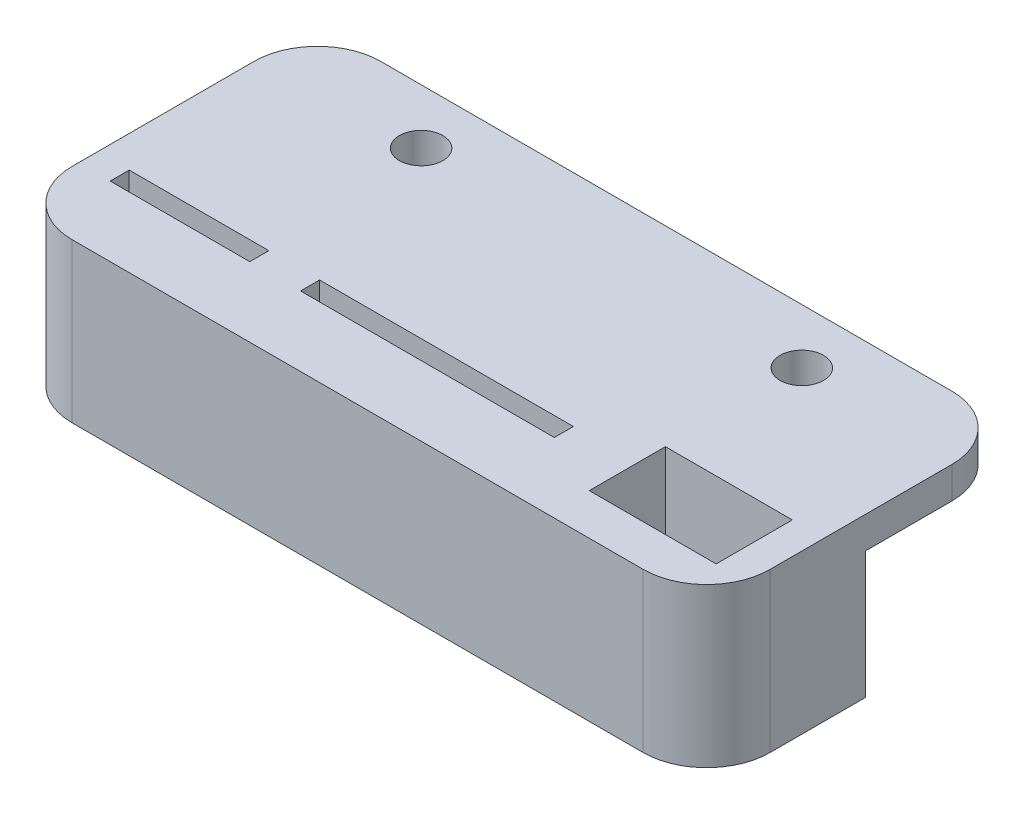
ISO-10303-21;
HEADER;
FILE_DESCRIPTION(('STEP AP214'),'2;1');
FILE_NAME('part.step','',(''),(''),'','','');
FILE_SCHEMA(('AUTOMOTIVE_DESIGN { 1 0 10303 214 1 1 1 1 }'));
ENDSEC;
DATA;
#1=APPLICATION_CONTEXT('core data for automotive mechanical design processes');
#2=APPLICATION_PROTOCOL_DEFINITION('international standard','automotive_design',2000,#1);
#3=PRODUCT_CONTEXT('',#1,'mechanical');
#4=PRODUCT('Part','Part','',(#3));
#5=PRODUCT_RELATED_PRODUCT_CATEGORY('part','',(#4));
#6=PRODUCT_DEFINITION_FORMATION('','',#4);
#7=PRODUCT_DEFINITION_CONTEXT('part definition',#1,'design');
#8=PRODUCT_DEFINITION('design','',#6,#7);
#9=PRODUCT_DEFINITION_SHAPE('','',#8);
#10=(LENGTH_UNIT() NAMED_UNIT(*) SI_UNIT(.MILLI.,.METRE.));
#11=(NAMED_UNIT(*) PLANE_ANGLE_UNIT() SI_UNIT($,.RADIAN.));
#12=(NAMED_UNIT(*) SI_UNIT($,.STERADIAN.) SOLID_ANGLE_UNIT());
#13=UNCERTAINTY_MEASURE_WITH_UNIT(LENGTH_MEASURE(1.E-05),#10,'distance_accuracy_value','');
#14=(GEOMETRIC_REPRESENTATION_CONTEXT(3) GLOBAL_UNCERTAINTY_ASSIGNED_CONTEXT((#13)) GLOBAL_UNIT_ASSIGNED_CONTEXT((#10,
#11,#12)) REPRESENTATION_CONTEXT('',''));
#15=CARTESIAN_POINT('',(0.,0.,0.));
#16=DIRECTION('',(0.,0.,1.));
#17=DIRECTION('',(1.,0.,0.));
#18=AXIS2_PLACEMENT_3D('',#15,#16,#17);
#19=CARTESIAN_POINT('',(55.,5.,15.));
#20=DIRECTION('',(-1.,0.,0.));
#21=DIRECTION('',(0.,0.,1.));
#22=AXIS2_PLACEMENT_3D('',#19,#20,#21);
#23=PLANE('',#22);
#24=DIRECTION('',(0.,0.,-1.));
#25=VECTOR('',#24,1.);
#26=CARTESIAN_POINT('',(55.,0.,15.));
#27=LINE('',#26,#25);
#28=CARTESIAN_POINT('',(55.,0.,15.));
#29=VERTEX_POINT('',#28);
#30=CARTESIAN_POINT('',(55.,0.,1.35));
#31=VERTEX_POINT('',#30);
#32=EDGE_CURVE('E321',#29,#31,#27,.T.);
#33=ORIENTED_EDGE('',*,*,#32,.T.);
#34=DIRECTION('',(0.,1.,0.));
#35=VECTOR('',#34,1.);
#36=CARTESIAN_POINT('',(55.,5.,1.35));
#37=LINE('',#36,#35);
#38=CARTESIAN_POINT('',(55.,5.,1.35));
#39=VERTEX_POINT('',#38);
#40=EDGE_CURVE('E11',#31,#39,#37,.T.);
#41=ORIENTED_EDGE('',*,*,#40,.T.);
#42=DIRECTION('',(0.,0.,-1.));
#43=VECTOR('',#42,1.);
#44=CARTESIAN_POINT('',(55.,5.,15.));
#45=LINE('',#44,#43);
#46=CARTESIAN_POINT('',(55.,5.,30.));
#47=VERTEX_POINT('',#46);
#48=EDGE_CURVE('E322',#47,#39,#45,.T.);
#49=ORIENTED_EDGE('',*,*,#48,.F.);
#50=DIRECTION('',(0.,1.,0.));
#51=VECTOR('',#50,1.);
#52=CARTESIAN_POINT('',(55.,-20.,30.));
#53=LINE('',#52,#51);
#54=CARTESIAN_POINT('',(55.,-20.,30.));
#55=VERTEX_POINT('',#54);
#56=EDGE_CURVE('E43',#47,#55,#53,.F.);
#57=ORIENTED_EDGE('',*,*,#56,.T.);
#58=DIRECTION('',(0.,0.,-1.));
#59=VECTOR('',#58,1.);
#60=CARTESIAN_POINT('',(55.,-20.,40.));
#61=LINE('',#60,#59);
#62=CARTESIAN_POINT('',(55.,-20.,15.));
#63=VERTEX_POINT('',#62);
#64=EDGE_CURVE('E308',#55,#63,#61,.T.);
#65=ORIENTED_EDGE('',*,*,#64,.T.);
#66=DIRECTION('',(0.,1.,0.));
#67=VECTOR('',#66,1.);
#68=CARTESIAN_POINT('',(55.,5.,15.));
#69=LINE('',#68,#67);
#70=EDGE_CURVE('E305',#63,#29,#69,.T.);
#71=ORIENTED_EDGE('',*,*,#70,.T.);
#72=EDGE_LOOP('',(#33,#41,#49,#57,#65,#71));
#73=FACE_BOUND('',#72,.T.);
#74=ADVANCED_FACE('F35',(#73),#23,.F.);
#75=CARTESIAN_POINT('',(-55.,5.,15.));
#76=DIRECTION('',(1.,0.,0.));
#77=DIRECTION('',(0.,0.,-1.));
#78=AXIS2_PLACEMENT_3D('',#75,#76,#77);
#79=PLANE('',#78);
#80=DIRECTION('',(0.,0.,-1.));
#81=VECTOR('',#80,1.);
#82=CARTESIAN_POINT('',(-55.,-20.,40.));
#83=LINE('',#82,#81);
#84=CARTESIAN_POINT('',(-55.,-20.,30.));
#85=VERTEX_POINT('',#84);
#86=CARTESIAN_POINT('',(-55.,-20.,15.));
#87=VERTEX_POINT('',#86);
#88=EDGE_CURVE('E319',#85,#87,#83,.T.);
#89=ORIENTED_EDGE('',*,*,#88,.F.);
#90=DIRECTION('',(0.,-1.,0.));
#91=VECTOR('',#90,1.);
#92=CARTESIAN_POINT('',(-55.,5.,30.));
#93=LINE('',#92,#91);
#94=CARTESIAN_POINT('',(-55.,5.,30.));
#95=VERTEX_POINT('',#94);
#96=EDGE_CURVE('E352',#85,#95,#93,.F.);
#97=ORIENTED_EDGE('',*,*,#96,.T.);
#98=DIRECTION('',(0.,0.,1.));
#99=VECTOR('',#98,1.);
#100=CARTESIAN_POINT('',(-55.,5.,15.));
#101=LINE('',#100,#99);
#102=CARTESIAN_POINT('',(-55.,5.,1.35));
#103=VERTEX_POINT('',#102);
#104=EDGE_CURVE('E325',#103,#95,#101,.T.);
#105=ORIENTED_EDGE('',*,*,#104,.F.);
#106=DIRECTION('',(0.,1.,0.));
#107=VECTOR('',#106,1.);
#108=CARTESIAN_POINT('',(-55.,5.,1.35));
#109=LINE('',#108,#107);
#110=CARTESIAN_POINT('',(-55.,0.,1.35));
#111=VERTEX_POINT('',#110);
#112=EDGE_CURVE('E350',#103,#111,#109,.F.);
#113=ORIENTED_EDGE('',*,*,#112,.T.);
#114=DIRECTION('',(0.,0.,1.));
#115=VECTOR('',#114,1.);
#116=CARTESIAN_POINT('',(-55.,0.,15.));
#117=LINE('',#116,#115);
#118=CARTESIAN_POINT('',(-55.,0.,15.));
#119=VERTEX_POINT('',#118);
#120=EDGE_CURVE('E331',#111,#119,#117,.T.);
#121=ORIENTED_EDGE('',*,*,#120,.T.);
#122=DIRECTION('',(0.,-1.,0.));
#123=VECTOR('',#122,1.);
#124=CARTESIAN_POINT('',(-55.,5.,15.));
#125=LINE('',#124,#123);
#126=EDGE_CURVE('E309',#119,#87,#125,.T.);
#127=ORIENTED_EDGE('',*,*,#126,.T.);
#128=EDGE_LOOP('',(#89,#97,#105,#113,#121,#127));
#129=FACE_BOUND('',#128,.T.);
#130=ADVANCED_FACE('F392',(#129),#79,.F.);
#131=CARTESIAN_POINT('',(0.,5.,0.));
#132=DIRECTION('',(0.,-1.,0.));
#133=DIRECTION('',(0.,0.,-1.));
#134=AXIS2_PLACEMENT_3D('',#131,#132,#133);
#135=PLANE('',#134);
#136=DIRECTION('',(1.,0.,0.));
#137=VECTOR('',#136,1.);
#138=CARTESIAN_POINT('',(-28.,5.,29.));
#139=LINE('',#138,#137);
#140=CARTESIAN_POINT('',(-50.,5.,29.));
#141=VERTEX_POINT('',#140);
#142=CARTESIAN_POINT('',(-28.,5.,29.));
#143=VERTEX_POINT('',#142);
#144=EDGE_CURVE('E248',#141,#143,#139,.T.);
#145=ORIENTED_EDGE('',*,*,#144,.F.);
#146=DIRECTION('',(0.,0.,1.));
#147=VECTOR('',#146,1.);
#148=CARTESIAN_POINT('',(-50.,5.,29.));
#149=LINE('',#148,#147);
#150=CARTESIAN_POINT('',(-50.,5.,26.));
#151=VERTEX_POINT('',#150);
#152=EDGE_CURVE('E246',#151,#141,#149,.T.);
#153=ORIENTED_EDGE('',*,*,#152,.F.);
#154=DIRECTION('',(-1.,0.,0.));
#155=VECTOR('',#154,1.);
#156=CARTESIAN_POINT('',(-28.,5.,26.));
#157=LINE('',#156,#155);
#158=CARTESIAN_POINT('',(-28.,5.,26.));
#159=VERTEX_POINT('',#158);
#160=EDGE_CURVE('E236',#159,#151,#157,.T.);
#161=ORIENTED_EDGE('',*,*,#160,.F.);
#162=DIRECTION('',(0.,0.,-1.));
#163=VECTOR('',#162,1.);
#164=CARTESIAN_POINT('',(-28.,5.,29.));
#165=LINE('',#164,#163);
#166=EDGE_CURVE('E251',#143,#159,#165,.T.);
#167=ORIENTED_EDGE('',*,*,#166,.F.);
#168=EDGE_LOOP('',(#145,#153,#161,#167));
#169=FACE_BOUND('',#168,.T.);
#170=DIRECTION('',(1.,0.,0.));
#171=VECTOR('',#170,1.);
#172=CARTESIAN_POINT('',(50.,5.,33.5));
#173=LINE('',#172,#171);
#174=CARTESIAN_POINT('',(30.,5.,33.5));
#175=VERTEX_POINT('',#174);
#176=CARTESIAN_POINT('',(50.,5.,33.5));
#177=VERTEX_POINT('',#176);
#178=EDGE_CURVE('E221',#175,#177,#173,.T.);
#179=ORIENTED_EDGE('',*,*,#178,.F.);
#180=DIRECTION('',(0.,0.,1.));
#181=VECTOR('',#180,1.);
#182=CARTESIAN_POINT('',(30.,5.,33.5));
#183=LINE('',#182,#181);
#184=CARTESIAN_POINT('',(30.,5.,21.5));
#185=VERTEX_POINT('',#184);
#186=EDGE_CURVE('E192',#185,#175,#183,.T.);
#187=ORIENTED_EDGE('',*,*,#186,.F.);
#188=DIRECTION('',(-1.,0.,0.));
#189=VECTOR('',#188,1.);
#190=CARTESIAN_POINT('',(50.,5.,21.5));
#191=LINE('',#190,#189);
#192=CARTESIAN_POINT('',(50.,5.,21.5));
#193=VERTEX_POINT('',#192);
#194=EDGE_CURVE('E210',#193,#185,#191,.T.);
#195=ORIENTED_EDGE('',*,*,#194,.F.);
#196=DIRECTION('',(0.,0.,-1.));
#197=VECTOR('',#196,1.);
#198=CARTESIAN_POINT('',(50.,5.,33.5));
#199=LINE('',#198,#197);
#200=EDGE_CURVE('E213',#177,#193,#199,.T.);
#201=ORIENTED_EDGE('',*,*,#200,.F.);
#202=EDGE_LOOP('',(#179,#187,#195,#201));
#203=FACE_BOUND('',#202,.T.);
#204=DIRECTION('',(1.,0.,0.));
#205=VECTOR('',#204,1.);
#206=CARTESIAN_POINT('',(20.,5.,29.));
#207=LINE('',#206,#205);
#208=CARTESIAN_POINT('',(-20.,5.,29.));
#209=VERTEX_POINT('',#208);
#210=CARTESIAN_POINT('',(20.,5.,29.));
#211=VERTEX_POINT('',#210);
#212=EDGE_CURVE('E278',#209,#211,#207,.T.);
#213=ORIENTED_EDGE('',*,*,#212,.F.);
#214=DIRECTION('',(0.,0.,1.));
#215=VECTOR('',#214,1.);
#216=CARTESIAN_POINT('',(-20.,5.,29.));
#217=LINE('',#216,#215);
#218=CARTESIAN_POINT('',(-20.,5.,26.));
#219=VERTEX_POINT('',#218);
#220=EDGE_CURVE('E228',#219,#209,#217,.T.);
#221=ORIENTED_EDGE('',*,*,#220,.F.);
#222=DIRECTION('',(-1.,0.,0.));
#223=VECTOR('',#222,1.);
#224=CARTESIAN_POINT('',(20.,5.,26.));
#225=LINE('',#224,#223);
#226=CARTESIAN_POINT('',(20.,5.,26.));
#227=VERTEX_POINT('',#226);
#228=EDGE_CURVE('E267',#227,#219,#225,.T.);
#229=ORIENTED_EDGE('',*,*,#228,.F.);
#230=DIRECTION('',(0.,0.,-1.));
#231=VECTOR('',#230,1.);
#232=CARTESIAN_POINT('',(20.,5.,29.));
#233=LINE('',#232,#231);
#234=EDGE_CURVE('E281',#211,#227,#233,.T.);
#235=ORIENTED_EDGE('',*,*,#234,.F.);
#236=EDGE_LOOP('',(#213,#221,#229,#235));
#237=FACE_BOUND('',#236,.T.);
#238=CARTESIAN_POINT('',(-30.,5.,0.));
#239=DIRECTION('',(0.,1.,0.));
#240=DIRECTION('',(0.,0.,1.));
#241=AXIS2_PLACEMENT_3D('',#238,#239,#240);
#242=CIRCLE('',#241,3.429);
#243=CARTESIAN_POINT('',(-30.,5.,3.42900000000001));
#244=VERTEX_POINT('',#243);
#245=EDGE_CURVE('E295',#244,#244,#242,.T.);
#246=ORIENTED_EDGE('',*,*,#245,.F.);
#247=EDGE_LOOP('',(#246));
#248=FACE_BOUND('',#247,.T.);
#249=CARTESIAN_POINT('',(30.,5.,0.));
#250=DIRECTION('',(0.,1.,0.));
#251=DIRECTION('',(0.,0.,1.));
#252=AXIS2_PLACEMENT_3D('',#249,#250,#251);
#253=CIRCLE('',#252,3.429);
#254=CARTESIAN_POINT('',(30.,5.,3.42899999999999));
#255=VERTEX_POINT('',#254);
#256=EDGE_CURVE('E288',#255,#255,#253,.T.);
#257=ORIENTED_EDGE('',*,*,#256,.F.);
#258=EDGE_LOOP('',(#257));
#259=FACE_BOUND('',#258,.T.);
#260=ORIENTED_EDGE('',*,*,#104,.T.);
#261=CARTESIAN_POINT('',(-45.,5.,30.));
#262=DIRECTION('',(0.,-1.,0.));
#263=DIRECTION('',(0.,0.,-1.));
#264=AXIS2_PLACEMENT_3D('',#261,#262,#263);
#265=CIRCLE('',#264,10.);
#266=CARTESIAN_POINT('',(-45.,5.,40.));
#267=VERTEX_POINT('',#266);
#268=EDGE_CURVE('E360',#95,#267,#265,.F.);
#269=ORIENTED_EDGE('',*,*,#268,.T.);
#270=DIRECTION('',(-1.,0.,0.));
#271=VECTOR('',#270,1.);
#272=CARTESIAN_POINT('',(-55.,5.,40.));
#273=LINE('',#272,#271);
#274=CARTESIAN_POINT('',(45.,5.,40.));
#275=VERTEX_POINT('',#274);
#276=EDGE_CURVE('E304',#275,#267,#273,.T.);
#277=ORIENTED_EDGE('',*,*,#276,.F.);
#278=CARTESIAN_POINT('',(45.,5.,30.));
#279=DIRECTION('',(0.,-1.,0.));
#280=DIRECTION('',(0.,0.,-1.));
#281=AXIS2_PLACEMENT_3D('',#278,#279,#280);
#282=CIRCLE('',#281,10.);
#283=EDGE_CURVE('E354',#275,#47,#282,.F.);
#284=ORIENTED_EDGE('',*,*,#283,.T.);
#285=ORIENTED_EDGE('',*,*,#48,.T.);
#286=CARTESIAN_POINT('',(45.,5.,1.35));
#287=DIRECTION('',(0.,-1.,0.));
#288=DIRECTION('',(0.,0.,-1.));
#289=AXIS2_PLACEMENT_3D('',#286,#287,#288);
#290=CIRCLE('',#289,10.);
#291=CARTESIAN_POINT('',(45.,5.,-8.65));
#292=VERTEX_POINT('',#291);
#293=EDGE_CURVE('E356',#39,#292,#290,.F.);
#294=ORIENTED_EDGE('',*,*,#293,.T.);
#295=DIRECTION('',(1.,0.,0.));
#296=VECTOR('',#295,1.);
#297=CARTESIAN_POINT('',(-55.,5.,-8.65));
#298=LINE('',#297,#296);
#299=CARTESIAN_POINT('',(-45.,5.,-8.65));
#300=VERTEX_POINT('',#299);
#301=EDGE_CURVE('E216',#300,#292,#298,.T.);
#302=ORIENTED_EDGE('',*,*,#301,.F.);
#303=CARTESIAN_POINT('',(-45.,5.,1.35));
#304=DIRECTION('',(0.,-1.,0.));
#305=DIRECTION('',(0.,0.,-1.));
#306=AXIS2_PLACEMENT_3D('',#303,#304,#305);
#307=CIRCLE('',#306,10.);
#308=EDGE_CURVE('E358',#300,#103,#307,.F.);
#309=ORIENTED_EDGE('',*,*,#308,.T.);
#310=EDGE_LOOP('',(#260,#269,#277,#284,#285,#294,#302,#309));
#311=FACE_BOUND('',#310,.T.);
#312=ADVANCED_FACE('F384',(#169,#203,#237,#248,#259,#311),#135,.F.);
#313=CARTESIAN_POINT('',(0.,0.,0.));
#314=DIRECTION('',(0.,-1.,0.));
#315=DIRECTION('',(0.,0.,-1.));
#316=AXIS2_PLACEMENT_3D('',#313,#314,#315);
#317=PLANE('',#316);
#318=ORIENTED_EDGE('',*,*,#120,.F.);
#319=CARTESIAN_POINT('',(-45.,0.,1.35));
#320=DIRECTION('',(0.,-1.,0.));
#321=DIRECTION('',(0.,0.,-1.));
#322=AXIS2_PLACEMENT_3D('',#319,#320,#321);
#323=CIRCLE('',#322,10.);
#324=CARTESIAN_POINT('',(-45.,0.,-8.65));
#325=VERTEX_POINT('',#324);
#326=EDGE_CURVE('E56',#111,#325,#323,.T.);
#327=ORIENTED_EDGE('',*,*,#326,.T.);
#328=DIRECTION('',(-1.,0.,0.));
#329=VECTOR('',#328,1.);
#330=CARTESIAN_POINT('',(0.,0.,-8.65));
#331=LINE('',#330,#329);
#332=CARTESIAN_POINT('',(45.,0.,-8.65));
#333=VERTEX_POINT('',#332);
#334=EDGE_CURVE('E329',#333,#325,#331,.T.);
#335=ORIENTED_EDGE('',*,*,#334,.F.);
#336=CARTESIAN_POINT('',(45.,0.,1.35));
#337=DIRECTION('',(0.,-1.,0.));
#338=DIRECTION('',(0.,0.,-1.));
#339=AXIS2_PLACEMENT_3D('',#336,#337,#338);
#340=CIRCLE('',#339,10.);
#341=EDGE_CURVE('E50',#333,#31,#340,.T.);
#342=ORIENTED_EDGE('',*,*,#341,.T.);
#343=ORIENTED_EDGE('',*,*,#32,.F.);
#344=DIRECTION('',(1.,0.,0.));
#345=VECTOR('',#344,1.);
#346=CARTESIAN_POINT('',(-55.,0.,15.));
#347=LINE('',#346,#345);
#348=EDGE_CURVE('E326',#119,#29,#347,.T.);
#349=ORIENTED_EDGE('',*,*,#348,.F.);
#350=EDGE_LOOP('',(#318,#327,#335,#342,#343,#349));
#351=FACE_BOUND('',#350,.T.);
#352=CARTESIAN_POINT('',(-30.,0.,0.));
#353=DIRECTION('',(0.,-1.,0.));
#354=DIRECTION('',(0.,0.,-1.));
#355=AXIS2_PLACEMENT_3D('',#352,#353,#354);
#356=CIRCLE('',#355,3.429);
#357=CARTESIAN_POINT('',(-30.,0.,-3.42899999999999));
#358=VERTEX_POINT('',#357);
#359=EDGE_CURVE('E313',#358,#358,#356,.T.);
#360=ORIENTED_EDGE('',*,*,#359,.F.);
#361=EDGE_LOOP('',(#360));
#362=FACE_BOUND('',#361,.T.);
#363=CARTESIAN_POINT('',(30.,0.,0.));
#364=DIRECTION('',(0.,-1.,0.));
#365=DIRECTION('',(0.,0.,-1.));
#366=AXIS2_PLACEMENT_3D('',#363,#364,#365);
#367=CIRCLE('',#366,3.429);
#368=CARTESIAN_POINT('',(30.,0.,-3.42900000000001));
#369=VERTEX_POINT('',#368);
#370=EDGE_CURVE('E298',#369,#369,#367,.T.);
#371=ORIENTED_EDGE('',*,*,#370,.F.);
#372=EDGE_LOOP('',(#371));
#373=FACE_BOUND('',#372,.T.);
#374=ADVANCED_FACE('F409',(#351,#362,#373),#317,.T.);
#375=CARTESIAN_POINT('',(0.,0.,15.));
#376=DIRECTION('',(0.,0.,1.));
#377=DIRECTION('',(1.,0.,0.));
#378=AXIS2_PLACEMENT_3D('',#375,#376,#377);
#379=PLANE('',#378);
#380=ORIENTED_EDGE('',*,*,#126,.F.);
#381=ORIENTED_EDGE('',*,*,#348,.T.);
#382=ORIENTED_EDGE('',*,*,#70,.F.);
#383=DIRECTION('',(1.,0.,0.));
#384=VECTOR('',#383,1.);
#385=CARTESIAN_POINT('',(-55.,-20.,15.));
#386=LINE('',#385,#384);
#387=EDGE_CURVE('E312',#87,#63,#386,.T.);
#388=ORIENTED_EDGE('',*,*,#387,.F.);
#389=EDGE_LOOP('',(#380,#381,#382,#388));
#390=FACE_BOUND('',#389,.T.);
#391=ADVANCED_FACE('F396',(#390),#379,.F.);
#392=CARTESIAN_POINT('',(-55.,-20.,40.));
#393=DIRECTION('',(0.,1.,0.));
#394=DIRECTION('',(0.,0.,1.));
#395=AXIS2_PLACEMENT_3D('',#392,#393,#394);
#396=PLANE('',#395);
#397=DIRECTION('',(-1.,0.,0.));
#398=VECTOR('',#397,1.);
#399=CARTESIAN_POINT('',(-28.,-20.,26.));
#400=LINE('',#399,#398);
#401=CARTESIAN_POINT('',(-28.,-20.,26.));
#402=VERTEX_POINT('',#401);
#403=CARTESIAN_POINT('',(-50.,-20.,26.));
#404=VERTEX_POINT('',#403);
#405=EDGE_CURVE('E242',#402,#404,#400,.T.);
#406=ORIENTED_EDGE('',*,*,#405,.T.);
#407=DIRECTION('',(0.,0.,1.));
#408=VECTOR('',#407,1.);
#409=CARTESIAN_POINT('',(-50.,-20.,29.));
#410=LINE('',#409,#408);
#411=CARTESIAN_POINT('',(-50.,-20.,29.));
#412=VERTEX_POINT('',#411);
#413=EDGE_CURVE('E232',#404,#412,#410,.T.);
#414=ORIENTED_EDGE('',*,*,#413,.T.);
#415=DIRECTION('',(1.,0.,0.));
#416=VECTOR('',#415,1.);
#417=CARTESIAN_POINT('',(-28.,-20.,29.));
#418=LINE('',#417,#416);
#419=CARTESIAN_POINT('',(-28.,-20.,29.));
#420=VERTEX_POINT('',#419);
#421=EDGE_CURVE('E235',#412,#420,#418,.T.);
#422=ORIENTED_EDGE('',*,*,#421,.T.);
#423=DIRECTION('',(0.,0.,-1.));
#424=VECTOR('',#423,1.);
#425=CARTESIAN_POINT('',(-28.,-20.,29.));
#426=LINE('',#425,#424);
#427=EDGE_CURVE('E239',#420,#402,#426,.T.);
#428=ORIENTED_EDGE('',*,*,#427,.T.);
#429=EDGE_LOOP('',(#406,#414,#422,#428));
#430=FACE_BOUND('',#429,.T.);
#431=DIRECTION('',(-1.,0.,0.));
#432=VECTOR('',#431,1.);
#433=CARTESIAN_POINT('',(50.,-20.,21.5));
#434=LINE('',#433,#432);
#435=CARTESIAN_POINT('',(50.,-20.,21.5));
#436=VERTEX_POINT('',#435);
#437=CARTESIAN_POINT('',(30.,-20.,21.5));
#438=VERTEX_POINT('',#437);
#439=EDGE_CURVE('E197',#436,#438,#434,.T.);
#440=ORIENTED_EDGE('',*,*,#439,.T.);
#441=DIRECTION('',(0.,0.,1.));
#442=VECTOR('',#441,1.);
#443=CARTESIAN_POINT('',(30.,-20.,33.5));
#444=LINE('',#443,#442);
#445=CARTESIAN_POINT('',(30.,-20.,33.5));
#446=VERTEX_POINT('',#445);
#447=EDGE_CURVE('E189',#438,#446,#444,.T.);
#448=ORIENTED_EDGE('',*,*,#447,.T.);
#449=DIRECTION('',(1.,0.,0.));
#450=VECTOR('',#449,1.);
#451=CARTESIAN_POINT('',(50.,-20.,33.5));
#452=LINE('',#451,#450);
#453=CARTESIAN_POINT('',(50.,-20.,33.5));
#454=VERTEX_POINT('',#453);
#455=EDGE_CURVE('E201',#446,#454,#452,.T.);
#456=ORIENTED_EDGE('',*,*,#455,.T.);
#457=DIRECTION('',(0.,0.,-1.));
#458=VECTOR('',#457,1.);
#459=CARTESIAN_POINT('',(50.,-20.,33.5));
#460=LINE('',#459,#458);
#461=EDGE_CURVE('E205',#454,#436,#460,.T.);
#462=ORIENTED_EDGE('',*,*,#461,.T.);
#463=EDGE_LOOP('',(#440,#448,#456,#462));
#464=FACE_BOUND('',#463,.T.);
#465=DIRECTION('',(-1.,0.,0.));
#466=VECTOR('',#465,1.);
#467=CARTESIAN_POINT('',(20.,-20.,26.));
#468=LINE('',#467,#466);
#469=CARTESIAN_POINT('',(20.,-20.,26.));
#470=VERTEX_POINT('',#469);
#471=CARTESIAN_POINT('',(-20.,-20.,26.));
#472=VERTEX_POINT('',#471);
#473=EDGE_CURVE('E273',#470,#472,#468,.T.);
#474=ORIENTED_EDGE('',*,*,#473,.T.);
#475=DIRECTION('',(0.,0.,1.));
#476=VECTOR('',#475,1.);
#477=CARTESIAN_POINT('',(-20.,-20.,29.));
#478=LINE('',#477,#476);
#479=CARTESIAN_POINT('',(-20.,-20.,29.));
#480=VERTEX_POINT('',#479);
#481=EDGE_CURVE('E263',#472,#480,#478,.T.);
#482=ORIENTED_EDGE('',*,*,#481,.T.);
#483=DIRECTION('',(1.,0.,0.));
#484=VECTOR('',#483,1.);
#485=CARTESIAN_POINT('',(20.,-20.,29.));
#486=LINE('',#485,#484);
#487=CARTESIAN_POINT('',(20.,-20.,29.));
#488=VERTEX_POINT('',#487);
#489=EDGE_CURVE('E266',#480,#488,#486,.T.);
#490=ORIENTED_EDGE('',*,*,#489,.T.);
#491=DIRECTION('',(0.,0.,-1.));
#492=VECTOR('',#491,1.);
#493=CARTESIAN_POINT('',(20.,-20.,29.));
#494=LINE('',#493,#492);
#495=EDGE_CURVE('E270',#488,#470,#494,.T.);
#496=ORIENTED_EDGE('',*,*,#495,.T.);
#497=EDGE_LOOP('',(#474,#482,#490,#496));
#498=FACE_BOUND('',#497,.T.);
#499=DIRECTION('',(1.,0.,0.));
#500=VECTOR('',#499,1.);
#501=CARTESIAN_POINT('',(-55.,-20.,40.));
#502=LINE('',#501,#500);
#503=CARTESIAN_POINT('',(-45.,-20.,40.));
#504=VERTEX_POINT('',#503);
#505=CARTESIAN_POINT('',(45.,-20.,40.));
#506=VERTEX_POINT('',#505);
#507=EDGE_CURVE('E301',#504,#506,#502,.T.);
#508=ORIENTED_EDGE('',*,*,#507,.F.);
#509=CARTESIAN_POINT('',(-45.,-20.,30.));
#510=DIRECTION('',(0.,1.,0.));
#511=DIRECTION('',(0.,0.,1.));
#512=AXIS2_PLACEMENT_3D('',#509,#510,#511);
#513=CIRCLE('',#512,10.);
#514=EDGE_CURVE('E348',#504,#85,#513,.F.);
#515=ORIENTED_EDGE('',*,*,#514,.T.);
#516=ORIENTED_EDGE('',*,*,#88,.T.);
#517=ORIENTED_EDGE('',*,*,#387,.T.);
#518=ORIENTED_EDGE('',*,*,#64,.F.);
#519=CARTESIAN_POINT('',(45.,-20.,30.));
#520=DIRECTION('',(0.,1.,0.));
#521=DIRECTION('',(0.,0.,1.));
#522=AXIS2_PLACEMENT_3D('',#519,#520,#521);
#523=CIRCLE('',#522,10.);
#524=EDGE_CURVE('E346',#55,#506,#523,.F.);
#525=ORIENTED_EDGE('',*,*,#524,.T.);
#526=EDGE_LOOP('',(#508,#515,#516,#517,#518,#525));
#527=FACE_BOUND('',#526,.T.);
#528=ADVANCED_FACE('F207',(#430,#464,#498,#527),#396,.F.);
#529=CARTESIAN_POINT('',(0.,0.,40.));
#530=DIRECTION('',(0.,0.,1.));
#531=DIRECTION('',(1.,0.,0.));
#532=AXIS2_PLACEMENT_3D('',#529,#530,#531);
#533=PLANE('',#532);
#534=ORIENTED_EDGE('',*,*,#276,.T.);
#535=DIRECTION('',(0.,-1.,0.));
#536=VECTOR('',#535,1.);
#537=CARTESIAN_POINT('',(-45.,-20.,40.));
#538=LINE('',#537,#536);
#539=EDGE_CURVE('E343',#267,#504,#538,.T.);
#540=ORIENTED_EDGE('',*,*,#539,.T.);
#541=ORIENTED_EDGE('',*,*,#507,.T.);
#542=DIRECTION('',(0.,1.,0.));
#543=VECTOR('',#542,1.);
#544=CARTESIAN_POINT('',(45.,5.,40.));
#545=LINE('',#544,#543);
#546=EDGE_CURVE('E340',#506,#275,#545,.T.);
#547=ORIENTED_EDGE('',*,*,#546,.T.);
#548=EDGE_LOOP('',(#534,#540,#541,#547));
#549=FACE_BOUND('',#548,.T.);
#550=ADVANCED_FACE('F381',(#549),#533,.T.);
#551=CARTESIAN_POINT('',(30.,-20.,0.));
#552=DIRECTION('',(0.,1.,0.));
#553=DIRECTION('',(0.,0.,1.));
#554=AXIS2_PLACEMENT_3D('',#551,#552,#553);
#555=CYLINDRICAL_SURFACE('',#554,3.429);
#556=ORIENTED_EDGE('',*,*,#370,.T.);
#557=EDGE_LOOP('',(#556));
#558=FACE_BOUND('',#557,.T.);
#559=ORIENTED_EDGE('',*,*,#256,.T.);
#560=EDGE_LOOP('',(#559));
#561=FACE_BOUND('',#560,.T.);
#562=ADVANCED_FACE('F417',(#558,#561),#555,.F.);
#563=CARTESIAN_POINT('',(-30.,-20.,0.));
#564=DIRECTION('',(0.,1.,0.));
#565=DIRECTION('',(0.,0.,1.));
#566=AXIS2_PLACEMENT_3D('',#563,#564,#565);
#567=CYLINDRICAL_SURFACE('',#566,3.429);
#568=ORIENTED_EDGE('',*,*,#359,.T.);
#569=EDGE_LOOP('',(#568));
#570=FACE_BOUND('',#569,.T.);
#571=ORIENTED_EDGE('',*,*,#245,.T.);
#572=EDGE_LOOP('',(#571));
#573=FACE_BOUND('',#572,.T.);
#574=ADVANCED_FACE('F420',(#570,#573),#567,.F.);
#575=CARTESIAN_POINT('',(-20.,-20.,29.));
#576=DIRECTION('',(-1.,0.,0.));
#577=DIRECTION('',(0.,0.,1.));
#578=AXIS2_PLACEMENT_3D('',#575,#576,#577);
#579=PLANE('',#578);
#580=ORIENTED_EDGE('',*,*,#220,.T.);
#581=DIRECTION('',(0.,1.,0.));
#582=VECTOR('',#581,1.);
#583=CARTESIAN_POINT('',(-20.,-20.,29.));
#584=LINE('',#583,#582);
#585=EDGE_CURVE('E276',#480,#209,#584,.T.);
#586=ORIENTED_EDGE('',*,*,#585,.F.);
#587=ORIENTED_EDGE('',*,*,#481,.F.);
#588=DIRECTION('',(0.,1.,0.));
#589=VECTOR('',#588,1.);
#590=CARTESIAN_POINT('',(-20.,-20.,26.));
#591=LINE('',#590,#589);
#592=EDGE_CURVE('E286',#472,#219,#591,.T.);
#593=ORIENTED_EDGE('',*,*,#592,.T.);
#594=EDGE_LOOP('',(#580,#586,#587,#593));
#595=FACE_BOUND('',#594,.T.);
#596=ADVANCED_FACE('F620',(#595),#579,.F.);
#597=CARTESIAN_POINT('',(20.,-20.,26.));
#598=DIRECTION('',(0.,0.,-1.));
#599=DIRECTION('',(-1.,0.,0.));
#600=AXIS2_PLACEMENT_3D('',#597,#598,#599);
#601=PLANE('',#600);
#602=ORIENTED_EDGE('',*,*,#228,.T.);
#603=ORIENTED_EDGE('',*,*,#592,.F.);
#604=ORIENTED_EDGE('',*,*,#473,.F.);
#605=DIRECTION('',(0.,1.,0.));
#606=VECTOR('',#605,1.);
#607=CARTESIAN_POINT('',(20.,-20.,26.));
#608=LINE('',#607,#606);
#609=EDGE_CURVE('E289',#470,#227,#608,.T.);
#610=ORIENTED_EDGE('',*,*,#609,.T.);
#611=EDGE_LOOP('',(#602,#603,#604,#610));
#612=FACE_BOUND('',#611,.T.);
#613=ADVANCED_FACE('F610',(#612),#601,.F.);
#614=CARTESIAN_POINT('',(20.,-20.,29.));
#615=DIRECTION('',(1.,0.,0.));
#616=DIRECTION('',(0.,0.,-1.));
#617=AXIS2_PLACEMENT_3D('',#614,#615,#616);
#618=PLANE('',#617);
#619=ORIENTED_EDGE('',*,*,#234,.T.);
#620=ORIENTED_EDGE('',*,*,#609,.F.);
#621=ORIENTED_EDGE('',*,*,#495,.F.);
#622=DIRECTION('',(0.,1.,0.));
#623=VECTOR('',#622,1.);
#624=CARTESIAN_POINT('',(20.,-20.,29.));
#625=LINE('',#624,#623);
#626=EDGE_CURVE('E291',#488,#211,#625,.T.);
#627=ORIENTED_EDGE('',*,*,#626,.T.);
#628=EDGE_LOOP('',(#619,#620,#621,#627));
#629=FACE_BOUND('',#628,.T.);
#630=ADVANCED_FACE('F600',(#629),#618,.F.);
#631=CARTESIAN_POINT('',(20.,-20.,29.));
#632=DIRECTION('',(0.,0.,1.));
#633=DIRECTION('',(1.,0.,0.));
#634=AXIS2_PLACEMENT_3D('',#631,#632,#633);
#635=PLANE('',#634);
#636=ORIENTED_EDGE('',*,*,#212,.T.);
#637=ORIENTED_EDGE('',*,*,#626,.F.);
#638=ORIENTED_EDGE('',*,*,#489,.F.);
#639=ORIENTED_EDGE('',*,*,#585,.T.);
#640=EDGE_LOOP('',(#636,#637,#638,#639));
#641=FACE_BOUND('',#640,.T.);
#642=ADVANCED_FACE('F591',(#641),#635,.F.);
#643=CARTESIAN_POINT('',(30.,-20.,33.5));
#644=DIRECTION('',(-1.,0.,0.));
#645=DIRECTION('',(0.,0.,1.));
#646=AXIS2_PLACEMENT_3D('',#643,#644,#645);
#647=PLANE('',#646);
#648=ORIENTED_EDGE('',*,*,#186,.T.);
#649=DIRECTION('',(0.,1.,0.));
#650=VECTOR('',#649,1.);
#651=CARTESIAN_POINT('',(30.,-20.,33.5));
#652=LINE('',#651,#650);
#653=EDGE_CURVE('E185',#446,#175,#652,.T.);
#654=ORIENTED_EDGE('',*,*,#653,.F.);
#655=ORIENTED_EDGE('',*,*,#447,.F.);
#656=DIRECTION('',(0.,1.,0.));
#657=VECTOR('',#656,1.);
#658=CARTESIAN_POINT('',(30.,-20.,21.5));
#659=LINE('',#658,#657);
#660=EDGE_CURVE('E226',#438,#185,#659,.T.);
#661=ORIENTED_EDGE('',*,*,#660,.T.);
#662=EDGE_LOOP('',(#648,#654,#655,#661));
#663=FACE_BOUND('',#662,.T.);
#664=ADVANCED_FACE('F187',(#663),#647,.F.);
#665=CARTESIAN_POINT('',(50.,-20.,21.5));
#666=DIRECTION('',(0.,0.,-1.));
#667=DIRECTION('',(-1.,0.,0.));
#668=AXIS2_PLACEMENT_3D('',#665,#666,#667);
#669=PLANE('',#668);
#670=ORIENTED_EDGE('',*,*,#194,.T.);
#671=ORIENTED_EDGE('',*,*,#660,.F.);
#672=ORIENTED_EDGE('',*,*,#439,.F.);
#673=DIRECTION('',(0.,1.,0.));
#674=VECTOR('',#673,1.);
#675=CARTESIAN_POINT('',(50.,-20.,21.5));
#676=LINE('',#675,#674);
#677=EDGE_CURVE('E229',#436,#193,#676,.T.);
#678=ORIENTED_EDGE('',*,*,#677,.T.);
#679=EDGE_LOOP('',(#670,#671,#672,#678));
#680=FACE_BOUND('',#679,.T.);
#681=ADVANCED_FACE('F572',(#680),#669,.F.);
#682=CARTESIAN_POINT('',(50.,-20.,33.5));
#683=DIRECTION('',(1.,0.,0.));
#684=DIRECTION('',(0.,0.,-1.));
#685=AXIS2_PLACEMENT_3D('',#682,#683,#684);
#686=PLANE('',#685);
#687=ORIENTED_EDGE('',*,*,#200,.T.);
#688=ORIENTED_EDGE('',*,*,#677,.F.);
#689=ORIENTED_EDGE('',*,*,#461,.F.);
#690=DIRECTION('',(0.,1.,0.));
#691=VECTOR('',#690,1.);
#692=CARTESIAN_POINT('',(50.,-20.,33.5));
#693=LINE('',#692,#691);
#694=EDGE_CURVE('E196',#454,#177,#693,.T.);
#695=ORIENTED_EDGE('',*,*,#694,.T.);
#696=EDGE_LOOP('',(#687,#688,#689,#695));
#697=FACE_BOUND('',#696,.T.);
#698=ADVANCED_FACE('F563',(#697),#686,.F.);
#699=CARTESIAN_POINT('',(50.,-20.,33.5));
#700=DIRECTION('',(0.,0.,1.));
#701=DIRECTION('',(1.,0.,0.));
#702=AXIS2_PLACEMENT_3D('',#699,#700,#701);
#703=PLANE('',#702);
#704=ORIENTED_EDGE('',*,*,#178,.T.);
#705=ORIENTED_EDGE('',*,*,#694,.F.);
#706=ORIENTED_EDGE('',*,*,#455,.F.);
#707=ORIENTED_EDGE('',*,*,#653,.T.);
#708=EDGE_LOOP('',(#704,#705,#706,#707));
#709=FACE_BOUND('',#708,.T.);
#710=ADVANCED_FACE('F202',(#709),#703,.F.);
#711=CARTESIAN_POINT('',(-50.,-20.,29.));
#712=DIRECTION('',(-1.,0.,0.));
#713=DIRECTION('',(0.,0.,1.));
#714=AXIS2_PLACEMENT_3D('',#711,#712,#713);
#715=PLANE('',#714);
#716=ORIENTED_EDGE('',*,*,#152,.T.);
#717=DIRECTION('',(0.,1.,0.));
#718=VECTOR('',#717,1.);
#719=CARTESIAN_POINT('',(-50.,-20.,29.));
#720=LINE('',#719,#718);
#721=EDGE_CURVE('E245',#412,#141,#720,.T.);
#722=ORIENTED_EDGE('',*,*,#721,.F.);
#723=ORIENTED_EDGE('',*,*,#413,.F.);
#724=DIRECTION('',(0.,1.,0.));
#725=VECTOR('',#724,1.);
#726=CARTESIAN_POINT('',(-50.,-20.,26.));
#727=LINE('',#726,#725);
#728=EDGE_CURVE('E222',#404,#151,#727,.T.);
#729=ORIENTED_EDGE('',*,*,#728,.T.);
#730=EDGE_LOOP('',(#716,#722,#723,#729));
#731=FACE_BOUND('',#730,.T.);
#732=ADVANCED_FACE('F544',(#731),#715,.F.);
#733=CARTESIAN_POINT('',(-28.,-20.,26.));
#734=DIRECTION('',(0.,0.,-1.));
#735=DIRECTION('',(-1.,0.,0.));
#736=AXIS2_PLACEMENT_3D('',#733,#734,#735);
#737=PLANE('',#736);
#738=ORIENTED_EDGE('',*,*,#160,.T.);
#739=ORIENTED_EDGE('',*,*,#728,.F.);
#740=ORIENTED_EDGE('',*,*,#405,.F.);
#741=DIRECTION('',(0.,1.,0.));
#742=VECTOR('',#741,1.);
#743=CARTESIAN_POINT('',(-28.,-20.,26.));
#744=LINE('',#743,#742);
#745=EDGE_CURVE('E257',#402,#159,#744,.T.);
#746=ORIENTED_EDGE('',*,*,#745,.T.);
#747=EDGE_LOOP('',(#738,#739,#740,#746));
#748=FACE_BOUND('',#747,.T.);
#749=ADVANCED_FACE('F534',(#748),#737,.F.);
#750=CARTESIAN_POINT('',(-28.,-20.,29.));
#751=DIRECTION('',(1.,0.,0.));
#752=DIRECTION('',(0.,0.,-1.));
#753=AXIS2_PLACEMENT_3D('',#750,#751,#752);
#754=PLANE('',#753);
#755=ORIENTED_EDGE('',*,*,#166,.T.);
#756=ORIENTED_EDGE('',*,*,#745,.F.);
#757=ORIENTED_EDGE('',*,*,#427,.F.);
#758=DIRECTION('',(0.,1.,0.));
#759=VECTOR('',#758,1.);
#760=CARTESIAN_POINT('',(-28.,-20.,29.));
#761=LINE('',#760,#759);
#762=EDGE_CURVE('E259',#420,#143,#761,.T.);
#763=ORIENTED_EDGE('',*,*,#762,.T.);
#764=EDGE_LOOP('',(#755,#756,#757,#763));
#765=FACE_BOUND('',#764,.T.);
#766=ADVANCED_FACE('F524',(#765),#754,.F.);
#767=CARTESIAN_POINT('',(-28.,-20.,29.));
#768=DIRECTION('',(0.,0.,1.));
#769=DIRECTION('',(1.,0.,0.));
#770=AXIS2_PLACEMENT_3D('',#767,#768,#769);
#771=PLANE('',#770);
#772=ORIENTED_EDGE('',*,*,#144,.T.);
#773=ORIENTED_EDGE('',*,*,#762,.F.);
#774=ORIENTED_EDGE('',*,*,#421,.F.);
#775=ORIENTED_EDGE('',*,*,#721,.T.);
#776=EDGE_LOOP('',(#772,#773,#774,#775));
#777=FACE_BOUND('',#776,.T.);
#778=ADVANCED_FACE('F473',(#777),#771,.F.);
#779=CARTESIAN_POINT('',(-55.,-20.,-8.65));
#780=DIRECTION('',(0.,0.,1.));
#781=DIRECTION('',(1.,0.,0.));
#782=AXIS2_PLACEMENT_3D('',#779,#780,#781);
#783=PLANE('',#782);
#784=ORIENTED_EDGE('',*,*,#334,.T.);
#785=DIRECTION('',(0.,1.,0.));
#786=VECTOR('',#785,1.);
#787=CARTESIAN_POINT('',(-45.,-20.,-8.65));
#788=LINE('',#787,#786);
#789=EDGE_CURVE('E364',#325,#300,#788,.T.);
#790=ORIENTED_EDGE('',*,*,#789,.T.);
#791=ORIENTED_EDGE('',*,*,#301,.T.);
#792=DIRECTION('',(0.,1.,0.));
#793=VECTOR('',#792,1.);
#794=CARTESIAN_POINT('',(45.,-20.,-8.65));
#795=LINE('',#794,#793);
#796=EDGE_CURVE('E362',#292,#333,#795,.F.);
#797=ORIENTED_EDGE('',*,*,#796,.T.);
#798=EDGE_LOOP('',(#784,#790,#791,#797));
#799=FACE_BOUND('',#798,.T.);
#800=ADVANCED_FACE('F404',(#799),#783,.F.);
#801=CARTESIAN_POINT('',(-45.,0.,30.));
#802=DIRECTION('',(0.,1.,0.));
#803=DIRECTION('',(0.,0.,1.));
#804=AXIS2_PLACEMENT_3D('',#801,#802,#803);
#805=CYLINDRICAL_SURFACE('',#804,10.);
#806=ORIENTED_EDGE('',*,*,#268,.F.);
#807=ORIENTED_EDGE('',*,*,#96,.F.);
#808=ORIENTED_EDGE('',*,*,#514,.F.);
#809=ORIENTED_EDGE('',*,*,#539,.F.);
#810=EDGE_LOOP('',(#806,#807,#808,#809));
#811=FACE_BOUND('',#810,.T.);
#812=ADVANCED_FACE('F389',(#811),#805,.T.);
#813=CARTESIAN_POINT('',(-45.,-20.,1.35));
#814=DIRECTION('',(0.,1.,0.));
#815=DIRECTION('',(0.,0.,1.));
#816=AXIS2_PLACEMENT_3D('',#813,#814,#815);
#817=CYLINDRICAL_SURFACE('',#816,10.);
#818=ORIENTED_EDGE('',*,*,#326,.F.);
#819=ORIENTED_EDGE('',*,*,#112,.F.);
#820=ORIENTED_EDGE('',*,*,#308,.F.);
#821=ORIENTED_EDGE('',*,*,#789,.F.);
#822=EDGE_LOOP('',(#818,#819,#820,#821));
#823=FACE_BOUND('',#822,.T.);
#824=ADVANCED_FACE('F407',(#823),#817,.T.);
#825=CARTESIAN_POINT('',(45.,5.,1.35));
#826=DIRECTION('',(0.,1.,0.));
#827=DIRECTION('',(0.,0.,1.));
#828=AXIS2_PLACEMENT_3D('',#825,#826,#827);
#829=CYLINDRICAL_SURFACE('',#828,10.);
#830=ORIENTED_EDGE('',*,*,#341,.F.);
#831=ORIENTED_EDGE('',*,*,#796,.F.);
#832=ORIENTED_EDGE('',*,*,#293,.F.);
#833=ORIENTED_EDGE('',*,*,#40,.F.);
#834=EDGE_LOOP('',(#830,#831,#832,#833));
#835=FACE_BOUND('',#834,.T.);
#836=ADVANCED_FACE('F399',(#835),#829,.T.);
#837=CARTESIAN_POINT('',(45.,0.,30.));
#838=DIRECTION('',(0.,-1.,0.));
#839=DIRECTION('',(0.,0.,-1.));
#840=AXIS2_PLACEMENT_3D('',#837,#838,#839);
#841=CYLINDRICAL_SURFACE('',#840,10.);
#842=ORIENTED_EDGE('',*,*,#524,.F.);
#843=ORIENTED_EDGE('',*,*,#56,.F.);
#844=ORIENTED_EDGE('',*,*,#283,.F.);
#845=ORIENTED_EDGE('',*,*,#546,.F.);
#846=EDGE_LOOP('',(#842,#843,#844,#845));
#847=FACE_BOUND('',#846,.T.);
#848=ADVANCED_FACE('F37',(#847),#841,.T.);
#849=CLOSED_SHELL('',(#74,#130,#312,#374,#391,#528,#550,#562,#574,#596,#613,#630,#642,#664,#681,
#698,#710,#732,#749,#766,#778,#800,#812,#824,#836,#848));
#850=MANIFOLD_SOLID_BREP('B2',#849);
#851=ADVANCED_BREP_SHAPE_REPRESENTATION('',(#18,#850),#14);
#852=SHAPE_DEFINITION_REPRESENTATION(#9,#851);
ENDSEC;
END-ISO-10303-21;
